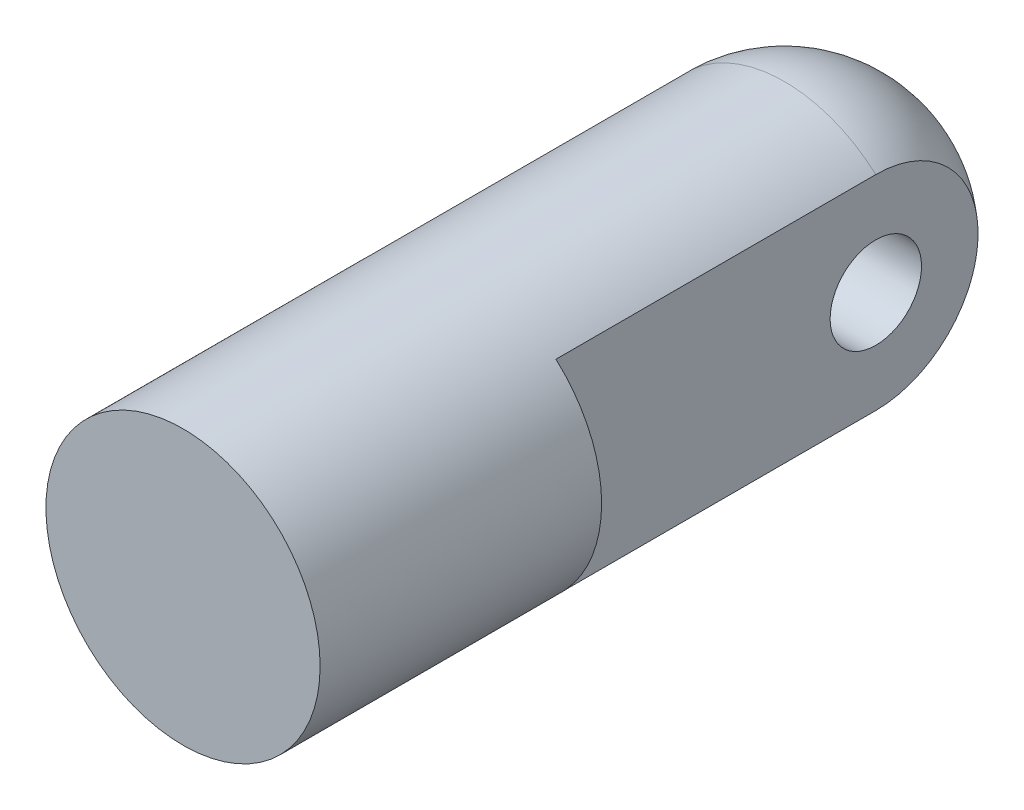
ISO-10303-21;
HEADER;
FILE_DESCRIPTION(('STEP AP214'),'2;1');
FILE_NAME('part.step','',(''),(''),'','','');
FILE_SCHEMA(('AUTOMOTIVE_DESIGN { 1 0 10303 214 1 1 1 1 }'));
ENDSEC;
DATA;
#1=APPLICATION_CONTEXT('core data for automotive mechanical design processes');
#2=APPLICATION_PROTOCOL_DEFINITION('international standard','automotive_design',2000,#1);
#3=PRODUCT_CONTEXT('',#1,'mechanical');
#4=PRODUCT('Part','Part','',(#3));
#5=PRODUCT_RELATED_PRODUCT_CATEGORY('part','',(#4));
#6=PRODUCT_DEFINITION_FORMATION('','',#4);
#7=PRODUCT_DEFINITION_CONTEXT('part definition',#1,'design');
#8=PRODUCT_DEFINITION('design','',#6,#7);
#9=PRODUCT_DEFINITION_SHAPE('','',#8);
#10=(LENGTH_UNIT() NAMED_UNIT(*) SI_UNIT(.MILLI.,.METRE.));
#11=(NAMED_UNIT(*) PLANE_ANGLE_UNIT() SI_UNIT($,.RADIAN.));
#12=(NAMED_UNIT(*) SI_UNIT($,.STERADIAN.) SOLID_ANGLE_UNIT());
#13=UNCERTAINTY_MEASURE_WITH_UNIT(LENGTH_MEASURE(1.E-05),#10,'distance_accuracy_value','');
#14=(GEOMETRIC_REPRESENTATION_CONTEXT(3) GLOBAL_UNCERTAINTY_ASSIGNED_CONTEXT((#13)) GLOBAL_UNIT_ASSIGNED_CONTEXT((#10,
#11,#12)) REPRESENTATION_CONTEXT('',''));
#15=CARTESIAN_POINT('',(0.,0.,0.));
#16=DIRECTION('',(0.,0.,1.));
#17=DIRECTION('',(1.,0.,0.));
#18=AXIS2_PLACEMENT_3D('',#15,#16,#17);
#19=CARTESIAN_POINT('',(0.,0.,-38.1));
#20=DIRECTION('',(0.,0.,-1.));
#21=DIRECTION('',(-1.,0.,0.));
#22=AXIS2_PLACEMENT_3D('',#19,#20,#21);
#23=CYLINDRICAL_SURFACE('',#22,9.525);
#24=DIRECTION('',(0.,0.,-1.));
#25=VECTOR('',#24,1.);
#26=CARTESIAN_POINT('',(6.35,-7.09951582856183,-38.1));
#27=LINE('',#26,#25);
#28=CARTESIAN_POINT('',(6.35,-7.09951582856183,-6.35));
#29=VERTEX_POINT('',#28);
#30=CARTESIAN_POINT('',(6.35,-7.09951582856183,-28.575));
#31=VERTEX_POINT('',#30);
#32=EDGE_CURVE('E49',#29,#31,#27,.T.);
#33=ORIENTED_EDGE('',*,*,#32,.F.);
#34=CARTESIAN_POINT('',(0.,0.,-6.35));
#35=DIRECTION('',(0.,0.,-1.));
#36=DIRECTION('',(-1.,0.,0.));
#37=AXIS2_PLACEMENT_3D('',#34,#35,#36);
#38=CIRCLE('',#37,9.525);
#39=CARTESIAN_POINT('',(6.35,7.09951582856182,-6.35));
#40=VERTEX_POINT('',#39);
#41=EDGE_CURVE('E11',#40,#29,#38,.T.);
#42=ORIENTED_EDGE('',*,*,#41,.F.);
#43=DIRECTION('',(0.,0.,-1.));
#44=VECTOR('',#43,1.);
#45=CARTESIAN_POINT('',(6.35,7.09951582856183,-38.1));
#46=LINE('',#45,#44);
#47=CARTESIAN_POINT('',(6.35,7.09951582856183,-28.575));
#48=VERTEX_POINT('',#47);
#49=EDGE_CURVE('E82',#48,#40,#46,.F.);
#50=ORIENTED_EDGE('',*,*,#49,.F.);
#51=CARTESIAN_POINT('',(0.,0.,-28.575));
#52=DIRECTION('',(0.,0.,-1.));
#53=DIRECTION('',(-1.,0.,0.));
#54=AXIS2_PLACEMENT_3D('',#51,#52,#53);
#55=CIRCLE('',#54,9.525);
#56=CARTESIAN_POINT('',(-6.35,7.09951582856183,-28.575));
#57=VERTEX_POINT('',#56);
#58=EDGE_CURVE('E96',#57,#48,#55,.T.);
#59=ORIENTED_EDGE('',*,*,#58,.F.);
#60=DIRECTION('',(0.,0.,-1.));
#61=VECTOR('',#60,1.);
#62=CARTESIAN_POINT('',(-6.35,7.09951582856183,-38.1));
#63=LINE('',#62,#61);
#64=CARTESIAN_POINT('',(-6.35,7.09951582856183,-6.35));
#65=VERTEX_POINT('',#64);
#66=EDGE_CURVE('E57',#57,#65,#63,.F.);
#67=ORIENTED_EDGE('',*,*,#66,.T.);
#68=CARTESIAN_POINT('',(0.,0.,-6.35));
#69=DIRECTION('',(0.,0.,1.));
#70=DIRECTION('',(1.,0.,0.));
#71=AXIS2_PLACEMENT_3D('',#68,#69,#70);
#72=CIRCLE('',#71,9.525);
#73=CARTESIAN_POINT('',(-6.35,-7.09951582856183,-6.35));
#74=VERTEX_POINT('',#73);
#75=EDGE_CURVE('E101',#65,#74,#72,.T.);
#76=ORIENTED_EDGE('',*,*,#75,.T.);
#77=DIRECTION('',(0.,0.,-1.));
#78=VECTOR('',#77,1.);
#79=CARTESIAN_POINT('',(-6.35,-7.09951582856183,-38.1));
#80=LINE('',#79,#78);
#81=CARTESIAN_POINT('',(-6.35,-7.09951582856183,-28.575));
#82=VERTEX_POINT('',#81);
#83=EDGE_CURVE('E94',#74,#82,#80,.T.);
#84=ORIENTED_EDGE('',*,*,#83,.T.);
#85=EDGE_CURVE('E87',#31,#82,#55,.T.);
#86=ORIENTED_EDGE('',*,*,#85,.F.);
#87=EDGE_LOOP('',(#33,#42,#50,#59,#67,#76,#84,#86));
#88=FACE_BOUND('',#87,.T.);
#89=CARTESIAN_POINT('',(0.,0.,13.208));
#90=DIRECTION('',(0.,0.,1.));
#91=DIRECTION('',(1.,0.,0.));
#92=AXIS2_PLACEMENT_3D('',#89,#90,#91);
#93=CIRCLE('',#92,9.525);
#94=CARTESIAN_POINT('',(9.525,0.,13.208));
#95=VERTEX_POINT('',#94);
#96=EDGE_CURVE('E182',#95,#95,#93,.T.);
#97=ORIENTED_EDGE('',*,*,#96,.F.);
#98=EDGE_LOOP('',(#97));
#99=FACE_BOUND('',#98,.T.);
#100=ADVANCED_FACE('F34',(#88,#99),#23,.T.);
#101=CARTESIAN_POINT('',(0.,0.,-28.575));
#102=DIRECTION('',(0.,0.,-1.));
#103=DIRECTION('',(1.,0.,0.));
#104=AXIS2_PLACEMENT_3D('',#101,#102,#103);
#105=SPHERICAL_SURFACE('',#104,9.525);
#106=CARTESIAN_POINT('',(6.35,0.,-28.575));
#107=DIRECTION('',(1.,0.,0.));
#108=DIRECTION('',(0.,0.,-1.));
#109=AXIS2_PLACEMENT_3D('',#106,#107,#108);
#110=CIRCLE('',#109,7.09951582856183);
#111=EDGE_CURVE('E42',#31,#48,#110,.T.);
#112=ORIENTED_EDGE('',*,*,#111,.F.);
#113=ORIENTED_EDGE('',*,*,#85,.T.);
#114=CARTESIAN_POINT('',(-6.35,0.,-28.575));
#115=DIRECTION('',(1.,0.,0.));
#116=DIRECTION('',(0.,0.,-1.));
#117=AXIS2_PLACEMENT_3D('',#114,#115,#116);
#118=CIRCLE('',#117,7.09951582856183);
#119=EDGE_CURVE('E99',#82,#57,#118,.T.);
#120=ORIENTED_EDGE('',*,*,#119,.T.);
#121=ORIENTED_EDGE('',*,*,#58,.T.);
#122=EDGE_LOOP('',(#112,#113,#120,#121));
#123=FACE_BOUND('',#122,.T.);
#124=ADVANCED_FACE('F106',(#123),#105,.T.);
#125=CARTESIAN_POINT('',(-6.35,-9.525,-6.35));
#126=DIRECTION('',(0.,0.,1.));
#127=DIRECTION('',(1.,0.,0.));
#128=AXIS2_PLACEMENT_3D('',#125,#126,#127);
#129=PLANE('',#128);
#130=DIRECTION('',(0.,1.,0.));
#131=VECTOR('',#130,1.);
#132=CARTESIAN_POINT('',(-6.35,-9.525,-6.35));
#133=LINE('',#132,#131);
#134=EDGE_CURVE('E88',#74,#65,#133,.T.);
#135=ORIENTED_EDGE('',*,*,#134,.F.);
#136=ORIENTED_EDGE('',*,*,#75,.F.);
#137=EDGE_LOOP('',(#135,#136));
#138=FACE_BOUND('',#137,.T.);
#139=ADVANCED_FACE('F110',(#138),#129,.F.);
#140=CARTESIAN_POINT('',(-6.35000000000001,-9.525,-66.3541794608881));
#141=DIRECTION('',(1.,0.,0.));
#142=DIRECTION('',(0.,0.,-1.));
#143=AXIS2_PLACEMENT_3D('',#140,#141,#142);
#144=PLANE('',#143);
#145=CARTESIAN_POINT('',(-6.35,0.,-28.575));
#146=DIRECTION('',(-1.,0.,0.));
#147=DIRECTION('',(0.,0.,1.));
#148=AXIS2_PLACEMENT_3D('',#145,#146,#147);
#149=CIRCLE('',#148,3.175);
#150=CARTESIAN_POINT('',(-6.35,0.,-25.4));
#151=VERTEX_POINT('',#150);
#152=EDGE_CURVE('E183',#151,#151,#149,.T.);
#153=ORIENTED_EDGE('',*,*,#152,.F.);
#154=EDGE_LOOP('',(#153));
#155=FACE_BOUND('',#154,.T.);
#156=ORIENTED_EDGE('',*,*,#134,.T.);
#157=ORIENTED_EDGE('',*,*,#66,.F.);
#158=ORIENTED_EDGE('',*,*,#119,.F.);
#159=ORIENTED_EDGE('',*,*,#83,.F.);
#160=EDGE_LOOP('',(#156,#157,#158,#159));
#161=FACE_BOUND('',#160,.T.);
#162=ADVANCED_FACE('F107',(#155,#161),#144,.F.);
#163=CARTESIAN_POINT('',(6.35,-9.525,-6.35));
#164=DIRECTION('',(0.,0.,-1.));
#165=DIRECTION('',(-1.,0.,0.));
#166=AXIS2_PLACEMENT_3D('',#163,#164,#165);
#167=PLANE('',#166);
#168=ORIENTED_EDGE('',*,*,#41,.T.);
#169=DIRECTION('',(0.,1.,0.));
#170=VECTOR('',#169,1.);
#171=CARTESIAN_POINT('',(6.35,-9.525,-6.35));
#172=LINE('',#171,#170);
#173=EDGE_CURVE('E78',#29,#40,#172,.T.);
#174=ORIENTED_EDGE('',*,*,#173,.T.);
#175=EDGE_LOOP('',(#168,#174));
#176=FACE_BOUND('',#175,.T.);
#177=ADVANCED_FACE('F77',(#176),#167,.T.);
#178=CARTESIAN_POINT('',(6.35000000000001,-9.525,-66.3541794608881));
#179=DIRECTION('',(1.,0.,0.));
#180=DIRECTION('',(0.,0.,-1.));
#181=AXIS2_PLACEMENT_3D('',#178,#179,#180);
#182=PLANE('',#181);
#183=CARTESIAN_POINT('',(6.35,0.,-28.575));
#184=DIRECTION('',(1.,0.,0.));
#185=DIRECTION('',(0.,0.,-1.));
#186=AXIS2_PLACEMENT_3D('',#183,#184,#185);
#187=CIRCLE('',#186,3.175);
#188=CARTESIAN_POINT('',(6.35,0.,-31.75));
#189=VERTEX_POINT('',#188);
#190=EDGE_CURVE('E37',#189,#189,#187,.T.);
#191=ORIENTED_EDGE('',*,*,#190,.F.);
#192=EDGE_LOOP('',(#191));
#193=FACE_BOUND('',#192,.T.);
#194=ORIENTED_EDGE('',*,*,#32,.T.);
#195=ORIENTED_EDGE('',*,*,#111,.T.);
#196=ORIENTED_EDGE('',*,*,#49,.T.);
#197=ORIENTED_EDGE('',*,*,#173,.F.);
#198=EDGE_LOOP('',(#194,#195,#196,#197));
#199=FACE_BOUND('',#198,.T.);
#200=ADVANCED_FACE('F81',(#193,#199),#182,.T.);
#201=CARTESIAN_POINT('',(9.525,0.,-28.575));
#202=DIRECTION('',(-1.,0.,0.));
#203=DIRECTION('',(0.,0.,1.));
#204=AXIS2_PLACEMENT_3D('',#201,#202,#203);
#205=CYLINDRICAL_SURFACE('',#204,3.175);
#206=ORIENTED_EDGE('',*,*,#190,.T.);
#207=EDGE_LOOP('',(#206));
#208=FACE_BOUND('',#207,.T.);
#209=ORIENTED_EDGE('',*,*,#152,.T.);
#210=EDGE_LOOP('',(#209));
#211=FACE_BOUND('',#210,.T.);
#212=ADVANCED_FACE('F153',(#208,#211),#205,.F.);
#213=CARTESIAN_POINT('',(0.,0.,13.208));
#214=DIRECTION('',(0.,0.,1.));
#215=DIRECTION('',(1.,0.,0.));
#216=AXIS2_PLACEMENT_3D('',#213,#214,#215);
#217=PLANE('',#216);
#218=ORIENTED_EDGE('',*,*,#96,.T.);
#219=EDGE_LOOP('',(#218));
#220=FACE_BOUND('',#219,.T.);
#221=ADVANCED_FACE('F162',(#220),#217,.T.);
#222=CLOSED_SHELL('',(#100,#124,#139,#162,#177,#200,#212,#221));
#223=MANIFOLD_SOLID_BREP('B2',#222);
#224=ADVANCED_BREP_SHAPE_REPRESENTATION('',(#18,#223),#14);
#225=SHAPE_DEFINITION_REPRESENTATION(#9,#224);
ENDSEC;
END-ISO-10303-21;
